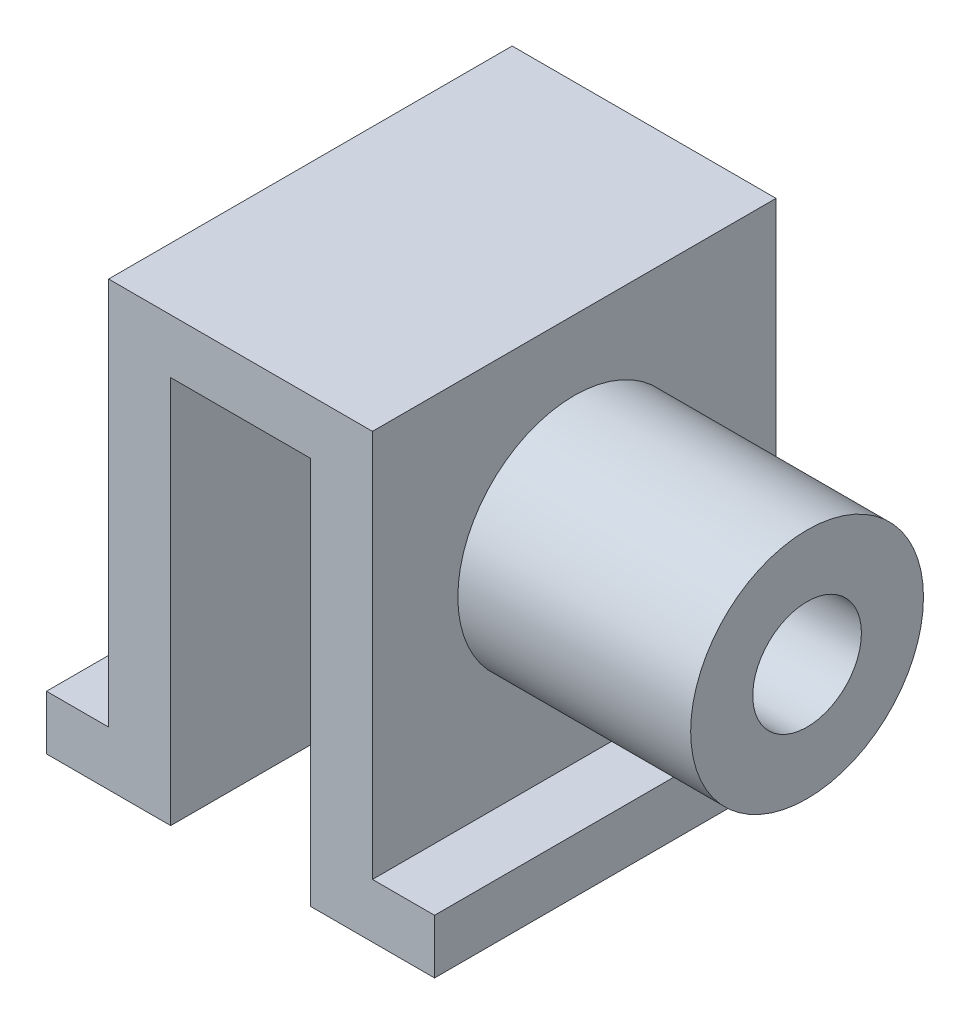
ISO-10303-21;
HEADER;
FILE_DESCRIPTION(('STEP AP214'),'2;1');
FILE_NAME('part.step','',(''),(''),'','','');
FILE_SCHEMA(('AUTOMOTIVE_DESIGN { 1 0 10303 214 1 1 1 1 }'));
ENDSEC;
DATA;
#1=APPLICATION_CONTEXT('core data for automotive mechanical design processes');
#2=APPLICATION_PROTOCOL_DEFINITION('international standard','automotive_design',2000,#1);
#3=PRODUCT_CONTEXT('',#1,'mechanical');
#4=PRODUCT('Part','Part','',(#3));
#5=PRODUCT_RELATED_PRODUCT_CATEGORY('part','',(#4));
#6=PRODUCT_DEFINITION_FORMATION('','',#4);
#7=PRODUCT_DEFINITION_CONTEXT('part definition',#1,'design');
#8=PRODUCT_DEFINITION('design','',#6,#7);
#9=PRODUCT_DEFINITION_SHAPE('','',#8);
#10=(LENGTH_UNIT() NAMED_UNIT(*) SI_UNIT(.MILLI.,.METRE.));
#11=(NAMED_UNIT(*) PLANE_ANGLE_UNIT() SI_UNIT($,.RADIAN.));
#12=(NAMED_UNIT(*) SI_UNIT($,.STERADIAN.) SOLID_ANGLE_UNIT());
#13=UNCERTAINTY_MEASURE_WITH_UNIT(LENGTH_MEASURE(1.E-05),#10,'distance_accuracy_value','');
#14=(GEOMETRIC_REPRESENTATION_CONTEXT(3) GLOBAL_UNCERTAINTY_ASSIGNED_CONTEXT((#13)) GLOBAL_UNIT_ASSIGNED_CONTEXT((#10,
#11,#12)) REPRESENTATION_CONTEXT('',''));
#15=CARTESIAN_POINT('',(0.,0.,0.));
#16=DIRECTION('',(0.,0.,1.));
#17=DIRECTION('',(1.,0.,0.));
#18=AXIS2_PLACEMENT_3D('',#15,#16,#17);
#19=CARTESIAN_POINT('',(0.,0.,-52.));
#20=DIRECTION('',(0.,-1.,0.));
#21=DIRECTION('',(0.,0.,-1.));
#22=AXIS2_PLACEMENT_3D('',#19,#20,#21);
#23=PLANE('',#22);
#24=DIRECTION('',(0.,0.,1.));
#25=VECTOR('',#24,1.);
#26=CARTESIAN_POINT('',(16.,0.,-52.));
#27=LINE('',#26,#25);
#28=CARTESIAN_POINT('',(16.,0.,-52.));
#29=VERTEX_POINT('',#28);
#30=CARTESIAN_POINT('',(16.,0.,0.));
#31=VERTEX_POINT('',#30);
#32=EDGE_CURVE('E208',#29,#31,#27,.T.);
#33=ORIENTED_EDGE('',*,*,#32,.T.);
#34=DIRECTION('',(1.,0.,0.));
#35=VECTOR('',#34,1.);
#36=CARTESIAN_POINT('',(0.,0.,0.));
#37=LINE('',#36,#35);
#38=CARTESIAN_POINT('',(0.,0.,0.));
#39=VERTEX_POINT('',#38);
#40=EDGE_CURVE('E163',#39,#31,#37,.T.);
#41=ORIENTED_EDGE('',*,*,#40,.F.);
#42=DIRECTION('',(0.,0.,1.));
#43=VECTOR('',#42,1.);
#44=CARTESIAN_POINT('',(0.,0.,-52.));
#45=LINE('',#44,#43);
#46=CARTESIAN_POINT('',(0.,0.,-52.));
#47=VERTEX_POINT('',#46);
#48=EDGE_CURVE('E150',#47,#39,#45,.T.);
#49=ORIENTED_EDGE('',*,*,#48,.F.);
#50=DIRECTION('',(1.,0.,0.));
#51=VECTOR('',#50,1.);
#52=CARTESIAN_POINT('',(0.,0.,-52.));
#53=LINE('',#52,#51);
#54=EDGE_CURVE('E155',#47,#29,#53,.T.);
#55=ORIENTED_EDGE('',*,*,#54,.T.);
#56=EDGE_LOOP('',(#33,#41,#49,#55));
#57=FACE_BOUND('',#56,.T.);
#58=ADVANCED_FACE('F37',(#57),#23,.T.);
#59=CARTESIAN_POINT('',(0.,0.,-52.));
#60=DIRECTION('',(-1.,0.,0.));
#61=DIRECTION('',(0.,0.,1.));
#62=AXIS2_PLACEMENT_3D('',#59,#60,#61);
#63=PLANE('',#62);
#64=DIRECTION('',(0.,0.,1.));
#65=VECTOR('',#64,1.);
#66=CARTESIAN_POINT('',(0.,7.,-52.));
#67=LINE('',#66,#65);
#68=CARTESIAN_POINT('',(0.,7.,-52.));
#69=VERTEX_POINT('',#68);
#70=CARTESIAN_POINT('',(0.,7.,0.));
#71=VERTEX_POINT('',#70);
#72=EDGE_CURVE('E52',#69,#71,#67,.T.);
#73=ORIENTED_EDGE('',*,*,#72,.F.);
#74=DIRECTION('',(0.,-1.,0.));
#75=VECTOR('',#74,1.);
#76=CARTESIAN_POINT('',(0.,0.,-52.));
#77=LINE('',#76,#75);
#78=EDGE_CURVE('E170',#69,#47,#77,.T.);
#79=ORIENTED_EDGE('',*,*,#78,.T.);
#80=ORIENTED_EDGE('',*,*,#48,.T.);
#81=DIRECTION('',(0.,-1.,0.));
#82=VECTOR('',#81,1.);
#83=CARTESIAN_POINT('',(0.,0.,0.));
#84=LINE('',#83,#82);
#85=EDGE_CURVE('E159',#71,#39,#84,.T.);
#86=ORIENTED_EDGE('',*,*,#85,.F.);
#87=EDGE_LOOP('',(#73,#79,#80,#86));
#88=FACE_BOUND('',#87,.T.);
#89=ADVANCED_FACE('F39',(#88),#63,.T.);
#90=CARTESIAN_POINT('',(0.,57.,-52.));
#91=DIRECTION('',(0.,1.,0.));
#92=DIRECTION('',(0.,0.,1.));
#93=AXIS2_PLACEMENT_3D('',#90,#91,#92);
#94=PLANE('',#93);
#95=DIRECTION('',(0.,0.,1.));
#96=VECTOR('',#95,1.);
#97=CARTESIAN_POINT('',(42.,57.,-52.));
#98=LINE('',#97,#96);
#99=CARTESIAN_POINT('',(42.,57.,-52.));
#100=VERTEX_POINT('',#99);
#101=CARTESIAN_POINT('',(42.,57.,0.));
#102=VERTEX_POINT('',#101);
#103=EDGE_CURVE('E60',#100,#102,#98,.T.);
#104=ORIENTED_EDGE('',*,*,#103,.F.);
#105=DIRECTION('',(-1.,0.,0.));
#106=VECTOR('',#105,1.);
#107=CARTESIAN_POINT('',(0.,57.,-52.));
#108=LINE('',#107,#106);
#109=CARTESIAN_POINT('',(8.,57.,-52.));
#110=VERTEX_POINT('',#109);
#111=EDGE_CURVE('E141',#100,#110,#108,.T.);
#112=ORIENTED_EDGE('',*,*,#111,.T.);
#113=DIRECTION('',(0.,0.,1.));
#114=VECTOR('',#113,1.);
#115=CARTESIAN_POINT('',(8.,57.,-52.));
#116=LINE('',#115,#114);
#117=CARTESIAN_POINT('',(8.,57.,0.));
#118=VERTEX_POINT('',#117);
#119=EDGE_CURVE('E236',#110,#118,#116,.T.);
#120=ORIENTED_EDGE('',*,*,#119,.T.);
#121=DIRECTION('',(-1.,0.,0.));
#122=VECTOR('',#121,1.);
#123=CARTESIAN_POINT('',(0.,57.,0.));
#124=LINE('',#123,#122);
#125=EDGE_CURVE('E143',#102,#118,#124,.T.);
#126=ORIENTED_EDGE('',*,*,#125,.F.);
#127=EDGE_LOOP('',(#104,#112,#120,#126));
#128=FACE_BOUND('',#127,.T.);
#129=ADVANCED_FACE('F139',(#128),#94,.T.);
#130=CARTESIAN_POINT('',(50.,0.,-52.));
#131=DIRECTION('',(1.,0.,0.));
#132=DIRECTION('',(0.,0.,-1.));
#133=AXIS2_PLACEMENT_3D('',#130,#131,#132);
#134=PLANE('',#133);
#135=DIRECTION('',(0.,0.,1.));
#136=VECTOR('',#135,1.);
#137=CARTESIAN_POINT('',(50.,7.,-52.));
#138=LINE('',#137,#136);
#139=CARTESIAN_POINT('',(50.,7.,-52.));
#140=VERTEX_POINT('',#139);
#141=CARTESIAN_POINT('',(50.,7.,0.));
#142=VERTEX_POINT('',#141);
#143=EDGE_CURVE('E184',#140,#142,#138,.T.);
#144=ORIENTED_EDGE('',*,*,#143,.T.);
#145=DIRECTION('',(0.,1.,0.));
#146=VECTOR('',#145,1.);
#147=CARTESIAN_POINT('',(50.,0.,0.));
#148=LINE('',#147,#146);
#149=CARTESIAN_POINT('',(50.,0.,0.));
#150=VERTEX_POINT('',#149);
#151=EDGE_CURVE('E166',#150,#142,#148,.T.);
#152=ORIENTED_EDGE('',*,*,#151,.F.);
#153=DIRECTION('',(0.,0.,1.));
#154=VECTOR('',#153,1.);
#155=CARTESIAN_POINT('',(50.,0.,-52.));
#156=LINE('',#155,#154);
#157=CARTESIAN_POINT('',(50.,0.,-52.));
#158=VERTEX_POINT('',#157);
#159=EDGE_CURVE('E45',#158,#150,#156,.T.);
#160=ORIENTED_EDGE('',*,*,#159,.F.);
#161=DIRECTION('',(0.,1.,0.));
#162=VECTOR('',#161,1.);
#163=CARTESIAN_POINT('',(50.,0.,-52.));
#164=LINE('',#163,#162);
#165=EDGE_CURVE('E151',#158,#140,#164,.T.);
#166=ORIENTED_EDGE('',*,*,#165,.T.);
#167=EDGE_LOOP('',(#144,#152,#160,#166));
#168=FACE_BOUND('',#167,.T.);
#169=ADVANCED_FACE('F183',(#168),#134,.T.);
#170=DIRECTION('',(0.,0.,1.));
#171=VECTOR('',#170,1.);
#172=CARTESIAN_POINT('',(34.,0.,-52.));
#173=LINE('',#172,#171);
#174=CARTESIAN_POINT('',(34.,0.,-52.));
#175=VERTEX_POINT('',#174);
#176=CARTESIAN_POINT('',(34.,0.,0.));
#177=VERTEX_POINT('',#176);
#178=EDGE_CURVE('E206',#175,#177,#173,.T.);
#179=ORIENTED_EDGE('',*,*,#178,.F.);
#180=EDGE_CURVE('E179',#175,#158,#53,.T.);
#181=ORIENTED_EDGE('',*,*,#180,.T.);
#182=ORIENTED_EDGE('',*,*,#159,.T.);
#183=EDGE_CURVE('E161',#177,#150,#37,.T.);
#184=ORIENTED_EDGE('',*,*,#183,.F.);
#185=EDGE_LOOP('',(#179,#181,#182,#184));
#186=FACE_BOUND('',#185,.T.);
#187=ADVANCED_FACE('F177',(#186),#23,.T.);
#188=CARTESIAN_POINT('',(0.,0.,-52.));
#189=DIRECTION('',(0.,0.,-1.));
#190=DIRECTION('',(-1.,0.,0.));
#191=AXIS2_PLACEMENT_3D('',#188,#189,#190);
#192=PLANE('',#191);
#193=DIRECTION('',(1.,0.,0.));
#194=VECTOR('',#193,1.);
#195=CARTESIAN_POINT('',(50.,7.,-52.));
#196=LINE('',#195,#194);
#197=CARTESIAN_POINT('',(42.,6.99999999999999,-52.));
#198=VERTEX_POINT('',#197);
#199=EDGE_CURVE('E133',#198,#140,#196,.T.);
#200=ORIENTED_EDGE('',*,*,#199,.T.);
#201=ORIENTED_EDGE('',*,*,#165,.F.);
#202=ORIENTED_EDGE('',*,*,#180,.F.);
#203=DIRECTION('',(0.,1.,0.));
#204=VECTOR('',#203,1.);
#205=CARTESIAN_POINT('',(34.,50.,-52.));
#206=LINE('',#205,#204);
#207=CARTESIAN_POINT('',(34.,50.,-52.));
#208=VERTEX_POINT('',#207);
#209=EDGE_CURVE('E224',#175,#208,#206,.T.);
#210=ORIENTED_EDGE('',*,*,#209,.T.);
#211=DIRECTION('',(-1.,0.,0.));
#212=VECTOR('',#211,1.);
#213=CARTESIAN_POINT('',(16.,50.,-52.));
#214=LINE('',#213,#212);
#215=CARTESIAN_POINT('',(16.,50.,-52.));
#216=VERTEX_POINT('',#215);
#217=EDGE_CURVE('E211',#208,#216,#214,.T.);
#218=ORIENTED_EDGE('',*,*,#217,.T.);
#219=DIRECTION('',(0.,-1.,0.));
#220=VECTOR('',#219,1.);
#221=CARTESIAN_POINT('',(16.,0.,-52.));
#222=LINE('',#221,#220);
#223=EDGE_CURVE('E198',#216,#29,#222,.T.);
#224=ORIENTED_EDGE('',*,*,#223,.T.);
#225=ORIENTED_EDGE('',*,*,#54,.F.);
#226=ORIENTED_EDGE('',*,*,#78,.F.);
#227=DIRECTION('',(1.,0.,0.));
#228=VECTOR('',#227,1.);
#229=CARTESIAN_POINT('',(0.,7.,-52.));
#230=LINE('',#229,#228);
#231=CARTESIAN_POINT('',(8.,6.99999999999999,-52.));
#232=VERTEX_POINT('',#231);
#233=EDGE_CURVE('E228',#69,#232,#230,.T.);
#234=ORIENTED_EDGE('',*,*,#233,.T.);
#235=DIRECTION('',(0.,1.,0.));
#236=VECTOR('',#235,1.);
#237=CARTESIAN_POINT('',(8.,6.99999999999999,-52.));
#238=LINE('',#237,#236);
#239=EDGE_CURVE('E149',#232,#110,#238,.T.);
#240=ORIENTED_EDGE('',*,*,#239,.T.);
#241=ORIENTED_EDGE('',*,*,#111,.F.);
#242=DIRECTION('',(0.,-1.,0.));
#243=VECTOR('',#242,1.);
#244=CARTESIAN_POINT('',(42.,6.99999999999999,-52.));
#245=LINE('',#244,#243);
#246=EDGE_CURVE('E126',#100,#198,#245,.T.);
#247=ORIENTED_EDGE('',*,*,#246,.T.);
#248=EDGE_LOOP('',(#200,#201,#202,#210,#218,#224,#225,#226,#234,#240,#241,#247));
#249=FACE_BOUND('',#248,.T.);
#250=ADVANCED_FACE('F146',(#249),#192,.T.);
#251=CARTESIAN_POINT('',(0.,0.,0.));
#252=DIRECTION('',(0.,0.,-1.));
#253=DIRECTION('',(-1.,0.,0.));
#254=AXIS2_PLACEMENT_3D('',#251,#252,#253);
#255=PLANE('',#254);
#256=ORIENTED_EDGE('',*,*,#151,.T.);
#257=DIRECTION('',(1.,0.,0.));
#258=VECTOR('',#257,1.);
#259=CARTESIAN_POINT('',(50.,7.,0.));
#260=LINE('',#259,#258);
#261=CARTESIAN_POINT('',(42.,6.99999999999999,0.));
#262=VERTEX_POINT('',#261);
#263=EDGE_CURVE('E134',#262,#142,#260,.T.);
#264=ORIENTED_EDGE('',*,*,#263,.F.);
#265=DIRECTION('',(0.,-1.,0.));
#266=VECTOR('',#265,1.);
#267=CARTESIAN_POINT('',(42.,6.99999999999999,0.));
#268=LINE('',#267,#266);
#269=EDGE_CURVE('E234',#102,#262,#268,.T.);
#270=ORIENTED_EDGE('',*,*,#269,.F.);
#271=ORIENTED_EDGE('',*,*,#125,.T.);
#272=DIRECTION('',(0.,1.,0.));
#273=VECTOR('',#272,1.);
#274=CARTESIAN_POINT('',(8.,6.99999999999999,0.));
#275=LINE('',#274,#273);
#276=CARTESIAN_POINT('',(8.,6.99999999999999,0.));
#277=VERTEX_POINT('',#276);
#278=EDGE_CURVE('E230',#277,#118,#275,.T.);
#279=ORIENTED_EDGE('',*,*,#278,.F.);
#280=DIRECTION('',(1.,0.,0.));
#281=VECTOR('',#280,1.);
#282=CARTESIAN_POINT('',(0.,7.,0.));
#283=LINE('',#282,#281);
#284=EDGE_CURVE('E232',#71,#277,#283,.T.);
#285=ORIENTED_EDGE('',*,*,#284,.F.);
#286=ORIENTED_EDGE('',*,*,#85,.T.);
#287=ORIENTED_EDGE('',*,*,#40,.T.);
#288=DIRECTION('',(0.,-1.,0.));
#289=VECTOR('',#288,1.);
#290=CARTESIAN_POINT('',(16.,0.,0.));
#291=LINE('',#290,#289);
#292=CARTESIAN_POINT('',(16.,50.,0.));
#293=VERTEX_POINT('',#292);
#294=EDGE_CURVE('E196',#293,#31,#291,.T.);
#295=ORIENTED_EDGE('',*,*,#294,.F.);
#296=DIRECTION('',(-1.,0.,0.));
#297=VECTOR('',#296,1.);
#298=CARTESIAN_POINT('',(16.,50.,0.));
#299=LINE('',#298,#297);
#300=CARTESIAN_POINT('',(34.,50.,0.));
#301=VERTEX_POINT('',#300);
#302=EDGE_CURVE('E194',#301,#293,#299,.T.);
#303=ORIENTED_EDGE('',*,*,#302,.F.);
#304=DIRECTION('',(0.,1.,0.));
#305=VECTOR('',#304,1.);
#306=CARTESIAN_POINT('',(34.,50.,0.));
#307=LINE('',#306,#305);
#308=EDGE_CURVE('E191',#177,#301,#307,.T.);
#309=ORIENTED_EDGE('',*,*,#308,.F.);
#310=ORIENTED_EDGE('',*,*,#183,.T.);
#311=EDGE_LOOP('',(#256,#264,#270,#271,#279,#285,#286,#287,#295,#303,#309,#310));
#312=FACE_BOUND('',#311,.T.);
#313=ADVANCED_FACE('F187',(#312),#255,.F.);
#314=CARTESIAN_POINT('',(16.,0.,-52.));
#315=DIRECTION('',(-1.,0.,0.));
#316=DIRECTION('',(0.,0.,1.));
#317=AXIS2_PLACEMENT_3D('',#314,#315,#316);
#318=PLANE('',#317);
#319=ORIENTED_EDGE('',*,*,#294,.T.);
#320=ORIENTED_EDGE('',*,*,#32,.F.);
#321=ORIENTED_EDGE('',*,*,#223,.F.);
#322=DIRECTION('',(0.,0.,1.));
#323=VECTOR('',#322,1.);
#324=CARTESIAN_POINT('',(16.,50.,-52.));
#325=LINE('',#324,#323);
#326=EDGE_CURVE('E162',#216,#293,#325,.T.);
#327=ORIENTED_EDGE('',*,*,#326,.T.);
#328=EDGE_LOOP('',(#319,#320,#321,#327));
#329=FACE_BOUND('',#328,.T.);
#330=ADVANCED_FACE('F293',(#329),#318,.F.);
#331=CARTESIAN_POINT('',(16.,50.,-52.));
#332=DIRECTION('',(0.,1.,0.));
#333=DIRECTION('',(0.,0.,1.));
#334=AXIS2_PLACEMENT_3D('',#331,#332,#333);
#335=PLANE('',#334);
#336=ORIENTED_EDGE('',*,*,#302,.T.);
#337=ORIENTED_EDGE('',*,*,#326,.F.);
#338=ORIENTED_EDGE('',*,*,#217,.F.);
#339=DIRECTION('',(0.,0.,1.));
#340=VECTOR('',#339,1.);
#341=CARTESIAN_POINT('',(34.,50.,-52.));
#342=LINE('',#341,#340);
#343=EDGE_CURVE('E204',#208,#301,#342,.T.);
#344=ORIENTED_EDGE('',*,*,#343,.T.);
#345=EDGE_LOOP('',(#336,#337,#338,#344));
#346=FACE_BOUND('',#345,.T.);
#347=ADVANCED_FACE('F297',(#346),#335,.F.);
#348=CARTESIAN_POINT('',(34.,50.,-52.));
#349=DIRECTION('',(1.,0.,0.));
#350=DIRECTION('',(0.,1.,0.));
#351=AXIS2_PLACEMENT_3D('',#348,#349,#350);
#352=PLANE('',#351);
#353=ORIENTED_EDGE('',*,*,#308,.T.);
#354=ORIENTED_EDGE('',*,*,#343,.F.);
#355=ORIENTED_EDGE('',*,*,#209,.F.);
#356=ORIENTED_EDGE('',*,*,#178,.T.);
#357=EDGE_LOOP('',(#353,#354,#355,#356));
#358=FACE_BOUND('',#357,.T.);
#359=ADVANCED_FACE('F298',(#358),#352,.F.);
#360=CARTESIAN_POINT('',(8.,6.99999999999999,-52.));
#361=DIRECTION('',(1.,0.,0.));
#362=DIRECTION('',(0.,0.,-1.));
#363=AXIS2_PLACEMENT_3D('',#360,#361,#362);
#364=PLANE('',#363);
#365=ORIENTED_EDGE('',*,*,#278,.T.);
#366=ORIENTED_EDGE('',*,*,#119,.F.);
#367=ORIENTED_EDGE('',*,*,#239,.F.);
#368=DIRECTION('',(0.,0.,1.));
#369=VECTOR('',#368,1.);
#370=CARTESIAN_POINT('',(8.,6.99999999999999,-52.));
#371=LINE('',#370,#369);
#372=EDGE_CURVE('E238',#232,#277,#371,.T.);
#373=ORIENTED_EDGE('',*,*,#372,.T.);
#374=EDGE_LOOP('',(#365,#366,#367,#373));
#375=FACE_BOUND('',#374,.T.);
#376=ADVANCED_FACE('F301',(#375),#364,.F.);
#377=CARTESIAN_POINT('',(0.,7.,-52.));
#378=DIRECTION('',(0.,-1.,0.));
#379=DIRECTION('',(1.,0.,0.));
#380=AXIS2_PLACEMENT_3D('',#377,#378,#379);
#381=PLANE('',#380);
#382=ORIENTED_EDGE('',*,*,#284,.T.);
#383=ORIENTED_EDGE('',*,*,#372,.F.);
#384=ORIENTED_EDGE('',*,*,#233,.F.);
#385=ORIENTED_EDGE('',*,*,#72,.T.);
#386=EDGE_LOOP('',(#382,#383,#384,#385));
#387=FACE_BOUND('',#386,.T.);
#388=ADVANCED_FACE('F307',(#387),#381,.F.);
#389=CARTESIAN_POINT('',(50.,7.,-52.));
#390=DIRECTION('',(0.,-1.,0.));
#391=DIRECTION('',(1.,0.,0.));
#392=AXIS2_PLACEMENT_3D('',#389,#390,#391);
#393=PLANE('',#392);
#394=ORIENTED_EDGE('',*,*,#263,.T.);
#395=ORIENTED_EDGE('',*,*,#143,.F.);
#396=ORIENTED_EDGE('',*,*,#199,.F.);
#397=DIRECTION('',(0.,0.,1.));
#398=VECTOR('',#397,1.);
#399=CARTESIAN_POINT('',(42.,6.99999999999999,-52.));
#400=LINE('',#399,#398);
#401=EDGE_CURVE('E128',#198,#262,#400,.T.);
#402=ORIENTED_EDGE('',*,*,#401,.T.);
#403=EDGE_LOOP('',(#394,#395,#396,#402));
#404=FACE_BOUND('',#403,.T.);
#405=ADVANCED_FACE('F270',(#404),#393,.F.);
#406=CARTESIAN_POINT('',(42.,6.99999999999999,-52.));
#407=DIRECTION('',(-1.,0.,0.));
#408=DIRECTION('',(0.,0.,1.));
#409=AXIS2_PLACEMENT_3D('',#406,#407,#408);
#410=PLANE('',#409);
#411=CARTESIAN_POINT('',(42.,33.,-26.));
#412=DIRECTION('',(-1.,0.,0.));
#413=DIRECTION('',(0.,0.,1.));
#414=AXIS2_PLACEMENT_3D('',#411,#412,#413);
#415=CIRCLE('',#414,15.);
#416=CARTESIAN_POINT('',(42.,33.,-11.));
#417=VERTEX_POINT('',#416);
#418=EDGE_CURVE('E11',#417,#417,#415,.F.);
#419=ORIENTED_EDGE('',*,*,#418,.F.);
#420=EDGE_LOOP('',(#419));
#421=FACE_BOUND('',#420,.T.);
#422=ORIENTED_EDGE('',*,*,#269,.T.);
#423=ORIENTED_EDGE('',*,*,#401,.F.);
#424=ORIENTED_EDGE('',*,*,#246,.F.);
#425=ORIENTED_EDGE('',*,*,#103,.T.);
#426=EDGE_LOOP('',(#422,#423,#424,#425));
#427=FACE_BOUND('',#426,.T.);
#428=ADVANCED_FACE('F127',(#421,#427),#410,.F.);
#429=CARTESIAN_POINT('',(72.,33.,-26.));
#430=DIRECTION('',(1.,0.,0.));
#431=DIRECTION('',(0.,0.,-1.));
#432=AXIS2_PLACEMENT_3D('',#429,#430,#431);
#433=PLANE('',#432);
#434=CARTESIAN_POINT('',(72.,33.,-26.));
#435=DIRECTION('',(1.,0.,0.));
#436=DIRECTION('',(0.,0.,-1.));
#437=AXIS2_PLACEMENT_3D('',#434,#435,#436);
#438=CIRCLE('',#437,15.);
#439=CARTESIAN_POINT('',(72.,33.,-41.));
#440=VERTEX_POINT('',#439);
#441=EDGE_CURVE('E239',#440,#440,#438,.T.);
#442=ORIENTED_EDGE('',*,*,#441,.T.);
#443=EDGE_LOOP('',(#442));
#444=FACE_BOUND('',#443,.T.);
#445=CARTESIAN_POINT('',(72.,33.,-26.));
#446=DIRECTION('',(1.,0.,0.));
#447=DIRECTION('',(0.,0.,-1.));
#448=AXIS2_PLACEMENT_3D('',#445,#446,#447);
#449=CIRCLE('',#448,7.);
#450=CARTESIAN_POINT('',(72.,33.,-33.));
#451=VERTEX_POINT('',#450);
#452=EDGE_CURVE('E249',#451,#451,#449,.T.);
#453=ORIENTED_EDGE('',*,*,#452,.F.);
#454=EDGE_LOOP('',(#453));
#455=FACE_BOUND('',#454,.T.);
#456=ADVANCED_FACE('F259',(#444,#455),#433,.T.);
#457=CARTESIAN_POINT('',(72.,33.,-26.));
#458=DIRECTION('',(-1.,0.,0.));
#459=DIRECTION('',(0.,0.,1.));
#460=AXIS2_PLACEMENT_3D('',#457,#458,#459);
#461=CYLINDRICAL_SURFACE('',#460,15.);
#462=ORIENTED_EDGE('',*,*,#441,.F.);
#463=EDGE_LOOP('',(#462));
#464=FACE_BOUND('',#463,.T.);
#465=ORIENTED_EDGE('',*,*,#418,.T.);
#466=EDGE_LOOP('',(#465));
#467=FACE_BOUND('',#466,.T.);
#468=ADVANCED_FACE('F261',(#464,#467),#461,.T.);
#469=CARTESIAN_POINT('',(72.,33.,-26.));
#470=DIRECTION('',(-1.,0.,0.));
#471=DIRECTION('',(0.,0.,1.));
#472=AXIS2_PLACEMENT_3D('',#469,#470,#471);
#473=CYLINDRICAL_SURFACE('',#472,7.);
#474=ORIENTED_EDGE('',*,*,#452,.T.);
#475=EDGE_LOOP('',(#474));
#476=FACE_BOUND('',#475,.T.);
#477=CARTESIAN_POINT('',(42.,33.,-26.));
#478=DIRECTION('',(1.,0.,0.));
#479=DIRECTION('',(0.,0.,-1.));
#480=AXIS2_PLACEMENT_3D('',#477,#478,#479);
#481=CIRCLE('',#480,7.);
#482=CARTESIAN_POINT('',(42.,33.,-33.));
#483=VERTEX_POINT('',#482);
#484=EDGE_CURVE('E250',#483,#483,#481,.T.);
#485=ORIENTED_EDGE('',*,*,#484,.F.);
#486=EDGE_LOOP('',(#485));
#487=FACE_BOUND('',#486,.T.);
#488=ADVANCED_FACE('F256',(#476,#487),#473,.F.);
#489=ORIENTED_EDGE('',*,*,#484,.T.);
#490=EDGE_LOOP('',(#489));
#491=FACE_BOUND('',#490,.T.);
#492=ADVANCED_FACE('F273',(#491),#410,.F.);
#493=CLOSED_SHELL('',(#58,#89,#129,#169,#187,#250,#313,#330,#347,#359,#376,#388,#405,#428,#456,
#468,#488,#492));
#494=MANIFOLD_SOLID_BREP('B2',#493);
#495=ADVANCED_BREP_SHAPE_REPRESENTATION('',(#18,#494),#14);
#496=SHAPE_DEFINITION_REPRESENTATION(#9,#495);
ENDSEC;
END-ISO-10303-21;
